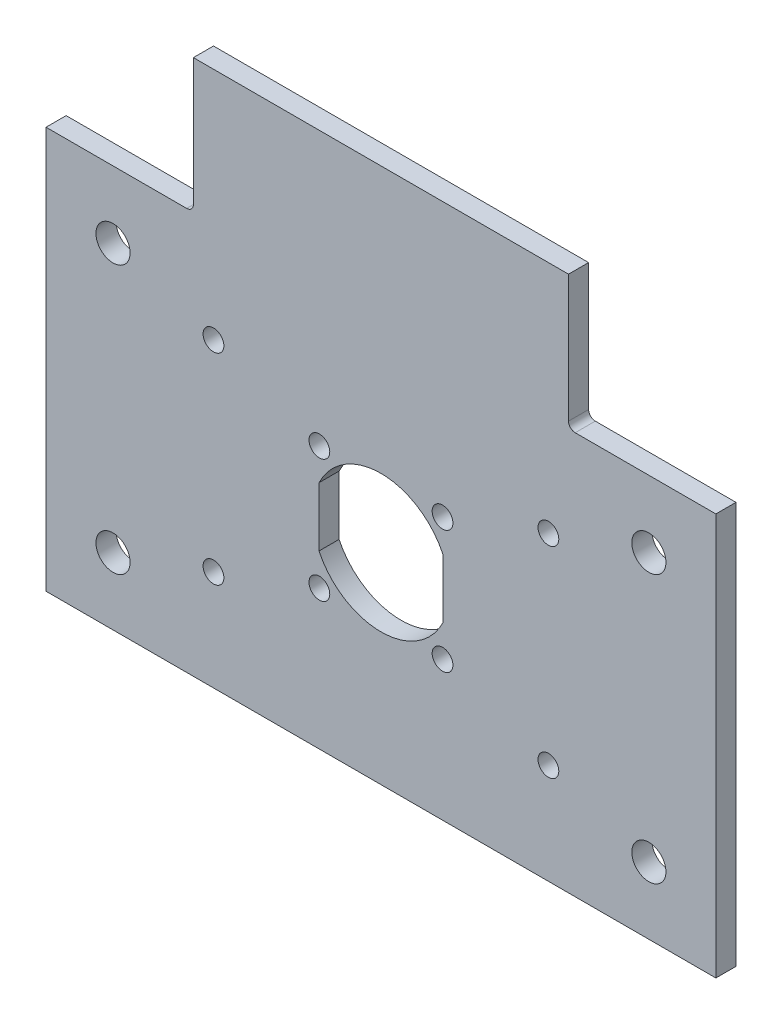
ISO-10303-21;
HEADER;
FILE_DESCRIPTION(('STEP AP214'),'2;1');
FILE_NAME('part.step','',(''),(''),'','','');
FILE_SCHEMA(('AUTOMOTIVE_DESIGN { 1 0 10303 214 1 1 1 1 }'));
ENDSEC;
DATA;
#1=APPLICATION_CONTEXT('core data for automotive mechanical design processes');
#2=APPLICATION_PROTOCOL_DEFINITION('international standard','automotive_design',2000,#1);
#3=PRODUCT_CONTEXT('',#1,'mechanical');
#4=PRODUCT('Part','Part','',(#3));
#5=PRODUCT_RELATED_PRODUCT_CATEGORY('part','',(#4));
#6=PRODUCT_DEFINITION_FORMATION('','',#4);
#7=PRODUCT_DEFINITION_CONTEXT('part definition',#1,'design');
#8=PRODUCT_DEFINITION('design','',#6,#7);
#9=PRODUCT_DEFINITION_SHAPE('','',#8);
#10=(LENGTH_UNIT() NAMED_UNIT(*) SI_UNIT(.MILLI.,.METRE.));
#11=(NAMED_UNIT(*) PLANE_ANGLE_UNIT() SI_UNIT($,.RADIAN.));
#12=(NAMED_UNIT(*) SI_UNIT($,.STERADIAN.) SOLID_ANGLE_UNIT());
#13=UNCERTAINTY_MEASURE_WITH_UNIT(LENGTH_MEASURE(1.E-05),#10,'distance_accuracy_value','');
#14=(GEOMETRIC_REPRESENTATION_CONTEXT(3) GLOBAL_UNCERTAINTY_ASSIGNED_CONTEXT((#13)) GLOBAL_UNIT_ASSIGNED_CONTEXT((#10,
#11,#12)) REPRESENTATION_CONTEXT('',''));
#15=CARTESIAN_POINT('',(0.,0.,0.));
#16=DIRECTION('',(0.,0.,1.));
#17=DIRECTION('',(1.,0.,0.));
#18=AXIS2_PLACEMENT_3D('',#15,#16,#17);
#19=CARTESIAN_POINT('',(0.,0.,3.));
#20=DIRECTION('',(0.,0.,1.));
#21=DIRECTION('',(1.,0.,0.));
#22=AXIS2_PLACEMENT_3D('',#19,#20,#21);
#23=PLANE('',#22);
#24=CARTESIAN_POINT('',(-25.,45.,3.));
#25=DIRECTION('',(0.,0.,1.));
#26=DIRECTION('',(1.,0.,0.));
#27=AXIS2_PLACEMENT_3D('',#24,#25,#26);
#28=CIRCLE('',#27,1.55);
#29=CARTESIAN_POINT('',(-23.45,45.,3.));
#30=VERTEX_POINT('',#29);
#31=EDGE_CURVE('E592',#30,#30,#28,.T.);
#32=ORIENTED_EDGE('',*,*,#31,.F.);
#33=EDGE_LOOP('',(#32));
#34=FACE_BOUND('',#33,.T.);
#35=CARTESIAN_POINT('',(-25.,15.,3.));
#36=DIRECTION('',(0.,0.,1.));
#37=DIRECTION('',(1.,0.,0.));
#38=AXIS2_PLACEMENT_3D('',#35,#36,#37);
#39=CIRCLE('',#38,1.55);
#40=CARTESIAN_POINT('',(-23.45,15.,3.));
#41=VERTEX_POINT('',#40);
#42=EDGE_CURVE('E596',#41,#41,#39,.T.);
#43=ORIENTED_EDGE('',*,*,#42,.F.);
#44=EDGE_LOOP('',(#43));
#45=FACE_BOUND('',#44,.T.);
#46=CARTESIAN_POINT('',(25.,15.,3.));
#47=DIRECTION('',(0.,0.,1.));
#48=DIRECTION('',(1.,0.,0.));
#49=AXIS2_PLACEMENT_3D('',#46,#47,#48);
#50=CIRCLE('',#49,1.55);
#51=CARTESIAN_POINT('',(26.55,15.,3.));
#52=VERTEX_POINT('',#51);
#53=EDGE_CURVE('E676',#52,#52,#50,.T.);
#54=ORIENTED_EDGE('',*,*,#53,.F.);
#55=EDGE_LOOP('',(#54));
#56=FACE_BOUND('',#55,.T.);
#57=CARTESIAN_POINT('',(25.,45.,3.));
#58=DIRECTION('',(0.,0.,1.));
#59=DIRECTION('',(1.,0.,0.));
#60=AXIS2_PLACEMENT_3D('',#57,#58,#59);
#61=CIRCLE('',#60,1.55);
#62=CARTESIAN_POINT('',(26.55,45.,3.));
#63=VERTEX_POINT('',#62);
#64=EDGE_CURVE('E605',#63,#63,#61,.T.);
#65=ORIENTED_EDGE('',*,*,#64,.F.);
#66=EDGE_LOOP('',(#65));
#67=FACE_BOUND('',#66,.T.);
#68=CARTESIAN_POINT('',(40.,50.,3.));
#69=DIRECTION('',(0.,0.,1.));
#70=DIRECTION('',(-1.,0.,0.));
#71=AXIS2_PLACEMENT_3D('',#68,#69,#70);
#72=CIRCLE('',#71,2.55);
#73=CARTESIAN_POINT('',(37.45,50.,3.));
#74=VERTEX_POINT('',#73);
#75=EDGE_CURVE('E604',#74,#74,#72,.T.);
#76=ORIENTED_EDGE('',*,*,#75,.F.);
#77=EDGE_LOOP('',(#76));
#78=FACE_BOUND('',#77,.T.);
#79=CARTESIAN_POINT('',(40.,10.,3.));
#80=DIRECTION('',(0.,0.,1.));
#81=DIRECTION('',(1.,0.,0.));
#82=AXIS2_PLACEMENT_3D('',#79,#80,#81);
#83=CIRCLE('',#82,2.55);
#84=CARTESIAN_POINT('',(42.55,10.,3.));
#85=VERTEX_POINT('',#84);
#86=EDGE_CURVE('E623',#85,#85,#83,.T.);
#87=ORIENTED_EDGE('',*,*,#86,.F.);
#88=EDGE_LOOP('',(#87));
#89=FACE_BOUND('',#88,.T.);
#90=CARTESIAN_POINT('',(-40.,10.,3.));
#91=DIRECTION('',(0.,0.,1.));
#92=DIRECTION('',(-1.,0.,0.));
#93=AXIS2_PLACEMENT_3D('',#90,#91,#92);
#94=CIRCLE('',#93,2.55);
#95=CARTESIAN_POINT('',(-42.55,10.,3.));
#96=VERTEX_POINT('',#95);
#97=EDGE_CURVE('E615',#96,#96,#94,.T.);
#98=ORIENTED_EDGE('',*,*,#97,.F.);
#99=EDGE_LOOP('',(#98));
#100=FACE_BOUND('',#99,.T.);
#101=CARTESIAN_POINT('',(-40.,50.,3.));
#102=DIRECTION('',(0.,0.,1.));
#103=DIRECTION('',(1.,0.,0.));
#104=AXIS2_PLACEMENT_3D('',#101,#102,#103);
#105=CIRCLE('',#104,2.55);
#106=CARTESIAN_POINT('',(-37.45,50.,3.));
#107=VERTEX_POINT('',#106);
#108=EDGE_CURVE('E614',#107,#107,#105,.T.);
#109=ORIENTED_EDGE('',*,*,#108,.F.);
#110=EDGE_LOOP('',(#109));
#111=FACE_BOUND('',#110,.T.);
#112=CARTESIAN_POINT('',(-9.19238815542516,20.8076118445749,3.));
#113=DIRECTION('',(0.,0.,1.));
#114=DIRECTION('',(1.,0.,0.));
#115=AXIS2_PLACEMENT_3D('',#112,#113,#114);
#116=CIRCLE('',#115,1.55);
#117=CARTESIAN_POINT('',(-7.64238815542516,20.8076118445749,3.));
#118=VERTEX_POINT('',#117);
#119=EDGE_CURVE('E638',#118,#118,#116,.T.);
#120=ORIENTED_EDGE('',*,*,#119,.F.);
#121=EDGE_LOOP('',(#120));
#122=FACE_BOUND('',#121,.T.);
#123=CARTESIAN_POINT('',(9.19238815542507,20.8076118445748,3.));
#124=DIRECTION('',(0.,0.,1.));
#125=DIRECTION('',(1.,0.,0.));
#126=AXIS2_PLACEMENT_3D('',#123,#124,#125);
#127=CIRCLE('',#126,1.55);
#128=CARTESIAN_POINT('',(10.7423881554251,20.8076118445748,3.));
#129=VERTEX_POINT('',#128);
#130=EDGE_CURVE('E655',#129,#129,#127,.T.);
#131=ORIENTED_EDGE('',*,*,#130,.F.);
#132=EDGE_LOOP('',(#131));
#133=FACE_BOUND('',#132,.T.);
#134=CARTESIAN_POINT('',(9.19238815542517,39.1923881554251,3.));
#135=DIRECTION('',(0.,0.,1.));
#136=DIRECTION('',(1.,0.,0.));
#137=AXIS2_PLACEMENT_3D('',#134,#135,#136);
#138=CIRCLE('',#137,1.55);
#139=CARTESIAN_POINT('',(10.7423881554252,39.1923881554251,3.));
#140=VERTEX_POINT('',#139);
#141=EDGE_CURVE('E647',#140,#140,#138,.T.);
#142=ORIENTED_EDGE('',*,*,#141,.F.);
#143=EDGE_LOOP('',(#142));
#144=FACE_BOUND('',#143,.T.);
#145=CARTESIAN_POINT('',(-9.19238815542507,39.1923881554252,3.));
#146=DIRECTION('',(0.,0.,1.));
#147=DIRECTION('',(1.,0.,0.));
#148=AXIS2_PLACEMENT_3D('',#145,#146,#147);
#149=CIRCLE('',#148,1.55);
#150=CARTESIAN_POINT('',(-7.64238815542507,39.1923881554252,3.));
#151=VERTEX_POINT('',#150);
#152=EDGE_CURVE('E646',#151,#151,#149,.T.);
#153=ORIENTED_EDGE('',*,*,#152,.F.);
#154=EDGE_LOOP('',(#153));
#155=FACE_BOUND('',#154,.T.);
#156=DIRECTION('',(-1.,0.,0.));
#157=VECTOR('',#156,1.);
#158=CARTESIAN_POINT('',(28.,80.,3.));
#159=LINE('',#158,#157);
#160=CARTESIAN_POINT('',(28.,80.,3.));
#161=VERTEX_POINT('',#160);
#162=CARTESIAN_POINT('',(-28.,80.,3.));
#163=VERTEX_POINT('',#162);
#164=EDGE_CURVE('E194',#161,#163,#159,.T.);
#165=ORIENTED_EDGE('',*,*,#164,.T.);
#166=DIRECTION('',(0.,-1.,0.));
#167=VECTOR('',#166,1.);
#168=CARTESIAN_POINT('',(-28.,80.,3.));
#169=LINE('',#168,#167);
#170=CARTESIAN_POINT('',(-28.,61.,3.));
#171=VERTEX_POINT('',#170);
#172=EDGE_CURVE('E198',#163,#171,#169,.T.);
#173=ORIENTED_EDGE('',*,*,#172,.T.);
#174=CARTESIAN_POINT('',(-29.,61.,3.));
#175=DIRECTION('',(0.,0.,1.));
#176=DIRECTION('',(1.,0.,0.));
#177=AXIS2_PLACEMENT_3D('',#174,#175,#176);
#178=CIRCLE('',#177,1.);
#179=CARTESIAN_POINT('',(-29.,60.,3.));
#180=VERTEX_POINT('',#179);
#181=EDGE_CURVE('E11',#171,#180,#178,.F.);
#182=ORIENTED_EDGE('',*,*,#181,.T.);
#183=DIRECTION('',(-1.,0.,0.));
#184=VECTOR('',#183,1.);
#185=CARTESIAN_POINT('',(-28.,60.,3.));
#186=LINE('',#185,#184);
#187=CARTESIAN_POINT('',(-50.,60.,3.));
#188=VERTEX_POINT('',#187);
#189=EDGE_CURVE('E202',#180,#188,#186,.T.);
#190=ORIENTED_EDGE('',*,*,#189,.T.);
#191=DIRECTION('',(0.,-1.,0.));
#192=VECTOR('',#191,1.);
#193=CARTESIAN_POINT('',(-50.,60.,3.));
#194=LINE('',#193,#192);
#195=CARTESIAN_POINT('',(-50.,0.,3.));
#196=VERTEX_POINT('',#195);
#197=EDGE_CURVE('E205',#188,#196,#194,.T.);
#198=ORIENTED_EDGE('',*,*,#197,.T.);
#199=DIRECTION('',(1.,0.,0.));
#200=VECTOR('',#199,1.);
#201=CARTESIAN_POINT('',(-50.,0.,3.));
#202=LINE('',#201,#200);
#203=CARTESIAN_POINT('',(50.,0.,3.));
#204=VERTEX_POINT('',#203);
#205=EDGE_CURVE('E208',#196,#204,#202,.T.);
#206=ORIENTED_EDGE('',*,*,#205,.T.);
#207=DIRECTION('',(0.,1.,0.));
#208=VECTOR('',#207,1.);
#209=CARTESIAN_POINT('',(50.,60.,3.));
#210=LINE('',#209,#208);
#211=CARTESIAN_POINT('',(50.,60.,3.));
#212=VERTEX_POINT('',#211);
#213=EDGE_CURVE('E211',#204,#212,#210,.T.);
#214=ORIENTED_EDGE('',*,*,#213,.T.);
#215=DIRECTION('',(-1.,0.,0.));
#216=VECTOR('',#215,1.);
#217=CARTESIAN_POINT('',(28.,60.,3.));
#218=LINE('',#217,#216);
#219=CARTESIAN_POINT('',(29.,60.,3.));
#220=VERTEX_POINT('',#219);
#221=EDGE_CURVE('E214',#212,#220,#218,.T.);
#222=ORIENTED_EDGE('',*,*,#221,.T.);
#223=CARTESIAN_POINT('',(29.,61.,3.));
#224=DIRECTION('',(0.,0.,1.));
#225=DIRECTION('',(1.,0.,0.));
#226=AXIS2_PLACEMENT_3D('',#223,#224,#225);
#227=CIRCLE('',#226,1.);
#228=CARTESIAN_POINT('',(28.,61.,3.));
#229=VERTEX_POINT('',#228);
#230=EDGE_CURVE('E285',#220,#229,#227,.F.);
#231=ORIENTED_EDGE('',*,*,#230,.T.);
#232=DIRECTION('',(0.,1.,0.));
#233=VECTOR('',#232,1.);
#234=CARTESIAN_POINT('',(28.,80.,3.));
#235=LINE('',#234,#233);
#236=EDGE_CURVE('E218',#229,#161,#235,.T.);
#237=ORIENTED_EDGE('',*,*,#236,.T.);
#238=EDGE_LOOP('',(#165,#173,#182,#190,#198,#206,#214,#222,#231,#237));
#239=FACE_BOUND('',#238,.T.);
#240=DIRECTION('',(0.,-1.,0.));
#241=VECTOR('',#240,1.);
#242=CARTESIAN_POINT('',(-9.25,34.4158804331639,3.));
#243=LINE('',#242,#241);
#244=CARTESIAN_POINT('',(-9.25,34.4158804331639,3.));
#245=VERTEX_POINT('',#244);
#246=CARTESIAN_POINT('',(-9.25,25.5841195668361,3.));
#247=VERTEX_POINT('',#246);
#248=EDGE_CURVE('E150',#245,#247,#243,.T.);
#249=ORIENTED_EDGE('',*,*,#248,.F.);
#250=CARTESIAN_POINT('',(0.,30.,3.));
#251=DIRECTION('',(0.,0.,1.));
#252=DIRECTION('',(1.,0.,0.));
#253=AXIS2_PLACEMENT_3D('',#250,#251,#252);
#254=CIRCLE('',#253,10.25);
#255=CARTESIAN_POINT('',(9.25,34.4158804331639,3.));
#256=VERTEX_POINT('',#255);
#257=EDGE_CURVE('E139',#256,#245,#254,.T.);
#258=ORIENTED_EDGE('',*,*,#257,.F.);
#259=DIRECTION('',(0.,1.,0.));
#260=VECTOR('',#259,1.);
#261=CARTESIAN_POINT('',(9.25,34.4158804331639,3.));
#262=LINE('',#261,#260);
#263=CARTESIAN_POINT('',(9.25,25.5841195668361,3.));
#264=VERTEX_POINT('',#263);
#265=EDGE_CURVE('E168',#264,#256,#262,.T.);
#266=ORIENTED_EDGE('',*,*,#265,.F.);
#267=CARTESIAN_POINT('',(0.,30.,3.));
#268=DIRECTION('',(0.,0.,1.));
#269=DIRECTION('',(1.,0.,0.));
#270=AXIS2_PLACEMENT_3D('',#267,#268,#269);
#271=CIRCLE('',#270,10.25);
#272=EDGE_CURVE('E164',#247,#264,#271,.T.);
#273=ORIENTED_EDGE('',*,*,#272,.F.);
#274=EDGE_LOOP('',(#249,#258,#266,#273));
#275=FACE_BOUND('',#274,.T.);
#276=ADVANCED_FACE('F38',(#34,#45,#56,#67,#78,#89,#100,#111,#122,#133,#144,#155,#239,#275),#23,.T.);
#277=CARTESIAN_POINT('',(0.,0.,0.));
#278=DIRECTION('',(0.,0.,1.));
#279=DIRECTION('',(1.,0.,0.));
#280=AXIS2_PLACEMENT_3D('',#277,#278,#279);
#281=PLANE('',#280);
#282=CARTESIAN_POINT('',(-25.,45.,0.));
#283=DIRECTION('',(0.,0.,1.));
#284=DIRECTION('',(1.,0.,0.));
#285=AXIS2_PLACEMENT_3D('',#282,#283,#284);
#286=CIRCLE('',#285,1.55);
#287=CARTESIAN_POINT('',(-23.45,45.,0.));
#288=VERTEX_POINT('',#287);
#289=EDGE_CURVE('E590',#288,#288,#286,.T.);
#290=ORIENTED_EDGE('',*,*,#289,.T.);
#291=EDGE_LOOP('',(#290));
#292=FACE_BOUND('',#291,.T.);
#293=CARTESIAN_POINT('',(-25.,15.,0.));
#294=DIRECTION('',(0.,0.,1.));
#295=DIRECTION('',(1.,0.,0.));
#296=AXIS2_PLACEMENT_3D('',#293,#294,#295);
#297=CIRCLE('',#296,1.55);
#298=CARTESIAN_POINT('',(-23.45,15.,0.));
#299=VERTEX_POINT('',#298);
#300=EDGE_CURVE('E680',#299,#299,#297,.T.);
#301=ORIENTED_EDGE('',*,*,#300,.T.);
#302=EDGE_LOOP('',(#301));
#303=FACE_BOUND('',#302,.T.);
#304=CARTESIAN_POINT('',(25.,15.,0.));
#305=DIRECTION('',(0.,0.,1.));
#306=DIRECTION('',(1.,0.,0.));
#307=AXIS2_PLACEMENT_3D('',#304,#305,#306);
#308=CIRCLE('',#307,1.55);
#309=CARTESIAN_POINT('',(26.55,15.,0.));
#310=VERTEX_POINT('',#309);
#311=EDGE_CURVE('E609',#310,#310,#308,.T.);
#312=ORIENTED_EDGE('',*,*,#311,.T.);
#313=EDGE_LOOP('',(#312));
#314=FACE_BOUND('',#313,.T.);
#315=CARTESIAN_POINT('',(25.,45.,0.));
#316=DIRECTION('',(0.,0.,1.));
#317=DIRECTION('',(1.,0.,0.));
#318=AXIS2_PLACEMENT_3D('',#315,#316,#317);
#319=CIRCLE('',#318,1.55);
#320=CARTESIAN_POINT('',(26.55,45.,0.));
#321=VERTEX_POINT('',#320);
#322=EDGE_CURVE('E600',#321,#321,#319,.T.);
#323=ORIENTED_EDGE('',*,*,#322,.T.);
#324=EDGE_LOOP('',(#323));
#325=FACE_BOUND('',#324,.T.);
#326=CARTESIAN_POINT('',(40.,50.,0.));
#327=DIRECTION('',(0.,0.,1.));
#328=DIRECTION('',(-1.,0.,0.));
#329=AXIS2_PLACEMENT_3D('',#326,#327,#328);
#330=CIRCLE('',#329,2.55);
#331=CARTESIAN_POINT('',(37.45,50.,0.));
#332=VERTEX_POINT('',#331);
#333=EDGE_CURVE('E627',#332,#332,#330,.T.);
#334=ORIENTED_EDGE('',*,*,#333,.T.);
#335=EDGE_LOOP('',(#334));
#336=FACE_BOUND('',#335,.T.);
#337=CARTESIAN_POINT('',(40.,10.,0.));
#338=DIRECTION('',(0.,0.,1.));
#339=DIRECTION('',(1.,0.,0.));
#340=AXIS2_PLACEMENT_3D('',#337,#338,#339);
#341=CIRCLE('',#340,2.55);
#342=CARTESIAN_POINT('',(42.55,10.,0.));
#343=VERTEX_POINT('',#342);
#344=EDGE_CURVE('E619',#343,#343,#341,.T.);
#345=ORIENTED_EDGE('',*,*,#344,.T.);
#346=EDGE_LOOP('',(#345));
#347=FACE_BOUND('',#346,.T.);
#348=CARTESIAN_POINT('',(-40.,10.,0.));
#349=DIRECTION('',(0.,0.,1.));
#350=DIRECTION('',(-1.,0.,0.));
#351=AXIS2_PLACEMENT_3D('',#348,#349,#350);
#352=CIRCLE('',#351,2.55);
#353=CARTESIAN_POINT('',(-42.55,10.,0.));
#354=VERTEX_POINT('',#353);
#355=EDGE_CURVE('E610',#354,#354,#352,.T.);
#356=ORIENTED_EDGE('',*,*,#355,.T.);
#357=EDGE_LOOP('',(#356));
#358=FACE_BOUND('',#357,.T.);
#359=CARTESIAN_POINT('',(-40.,50.,0.));
#360=DIRECTION('',(0.,0.,1.));
#361=DIRECTION('',(1.,0.,0.));
#362=AXIS2_PLACEMENT_3D('',#359,#360,#361);
#363=CIRCLE('',#362,2.55);
#364=CARTESIAN_POINT('',(-37.45,50.,0.));
#365=VERTEX_POINT('',#364);
#366=EDGE_CURVE('E634',#365,#365,#363,.T.);
#367=ORIENTED_EDGE('',*,*,#366,.T.);
#368=EDGE_LOOP('',(#367));
#369=FACE_BOUND('',#368,.T.);
#370=CARTESIAN_POINT('',(-9.19238815542516,20.8076118445749,0.));
#371=DIRECTION('',(0.,0.,1.));
#372=DIRECTION('',(1.,0.,0.));
#373=AXIS2_PLACEMENT_3D('',#370,#371,#372);
#374=CIRCLE('',#373,1.55);
#375=CARTESIAN_POINT('',(-7.64238815542516,20.8076118445749,0.));
#376=VERTEX_POINT('',#375);
#377=EDGE_CURVE('E659',#376,#376,#374,.T.);
#378=ORIENTED_EDGE('',*,*,#377,.T.);
#379=EDGE_LOOP('',(#378));
#380=FACE_BOUND('',#379,.T.);
#381=CARTESIAN_POINT('',(9.19238815542507,20.8076118445748,0.));
#382=DIRECTION('',(0.,0.,1.));
#383=DIRECTION('',(1.,0.,0.));
#384=AXIS2_PLACEMENT_3D('',#381,#382,#383);
#385=CIRCLE('',#384,1.55);
#386=CARTESIAN_POINT('',(10.7423881554251,20.8076118445748,0.));
#387=VERTEX_POINT('',#386);
#388=EDGE_CURVE('E651',#387,#387,#385,.T.);
#389=ORIENTED_EDGE('',*,*,#388,.T.);
#390=EDGE_LOOP('',(#389));
#391=FACE_BOUND('',#390,.T.);
#392=CARTESIAN_POINT('',(9.19238815542517,39.1923881554251,0.));
#393=DIRECTION('',(0.,0.,1.));
#394=DIRECTION('',(1.,0.,0.));
#395=AXIS2_PLACEMENT_3D('',#392,#393,#394);
#396=CIRCLE('',#395,1.55);
#397=CARTESIAN_POINT('',(10.7423881554252,39.1923881554251,0.));
#398=VERTEX_POINT('',#397);
#399=EDGE_CURVE('E642',#398,#398,#396,.T.);
#400=ORIENTED_EDGE('',*,*,#399,.T.);
#401=EDGE_LOOP('',(#400));
#402=FACE_BOUND('',#401,.T.);
#403=CARTESIAN_POINT('',(-9.19238815542507,39.1923881554252,0.));
#404=DIRECTION('',(0.,0.,1.));
#405=DIRECTION('',(1.,0.,0.));
#406=AXIS2_PLACEMENT_3D('',#403,#404,#405);
#407=CIRCLE('',#406,1.55);
#408=CARTESIAN_POINT('',(-7.64238815542507,39.1923881554252,0.));
#409=VERTEX_POINT('',#408);
#410=EDGE_CURVE('E177',#409,#409,#407,.T.);
#411=ORIENTED_EDGE('',*,*,#410,.T.);
#412=EDGE_LOOP('',(#411));
#413=FACE_BOUND('',#412,.T.);
#414=DIRECTION('',(-1.,0.,0.));
#415=VECTOR('',#414,1.);
#416=CARTESIAN_POINT('',(28.,80.,0.));
#417=LINE('',#416,#415);
#418=CARTESIAN_POINT('',(28.,80.,0.));
#419=VERTEX_POINT('',#418);
#420=CARTESIAN_POINT('',(-28.,80.,0.));
#421=VERTEX_POINT('',#420);
#422=EDGE_CURVE('E159',#419,#421,#417,.T.);
#423=ORIENTED_EDGE('',*,*,#422,.F.);
#424=DIRECTION('',(0.,1.,0.));
#425=VECTOR('',#424,1.);
#426=CARTESIAN_POINT('',(28.,80.,0.));
#427=LINE('',#426,#425);
#428=CARTESIAN_POINT('',(28.,61.,0.));
#429=VERTEX_POINT('',#428);
#430=EDGE_CURVE('E199',#429,#419,#427,.T.);
#431=ORIENTED_EDGE('',*,*,#430,.F.);
#432=CARTESIAN_POINT('',(29.,61.,0.));
#433=DIRECTION('',(0.,0.,1.));
#434=DIRECTION('',(1.,0.,0.));
#435=AXIS2_PLACEMENT_3D('',#432,#433,#434);
#436=CIRCLE('',#435,1.);
#437=CARTESIAN_POINT('',(29.,60.,0.));
#438=VERTEX_POINT('',#437);
#439=EDGE_CURVE('E282',#429,#438,#436,.T.);
#440=ORIENTED_EDGE('',*,*,#439,.T.);
#441=DIRECTION('',(-1.,0.,0.));
#442=VECTOR('',#441,1.);
#443=CARTESIAN_POINT('',(28.,60.,0.));
#444=LINE('',#443,#442);
#445=CARTESIAN_POINT('',(50.,60.,0.));
#446=VERTEX_POINT('',#445);
#447=EDGE_CURVE('E240',#446,#438,#444,.T.);
#448=ORIENTED_EDGE('',*,*,#447,.F.);
#449=DIRECTION('',(0.,1.,0.));
#450=VECTOR('',#449,1.);
#451=CARTESIAN_POINT('',(50.,60.,0.));
#452=LINE('',#451,#450);
#453=CARTESIAN_POINT('',(50.,0.,0.));
#454=VERTEX_POINT('',#453);
#455=EDGE_CURVE('E237',#454,#446,#452,.T.);
#456=ORIENTED_EDGE('',*,*,#455,.F.);
#457=DIRECTION('',(1.,0.,0.));
#458=VECTOR('',#457,1.);
#459=CARTESIAN_POINT('',(-50.,0.,0.));
#460=LINE('',#459,#458);
#461=CARTESIAN_POINT('',(-50.,0.,0.));
#462=VERTEX_POINT('',#461);
#463=EDGE_CURVE('E234',#462,#454,#460,.T.);
#464=ORIENTED_EDGE('',*,*,#463,.F.);
#465=DIRECTION('',(0.,-1.,0.));
#466=VECTOR('',#465,1.);
#467=CARTESIAN_POINT('',(-50.,60.,0.));
#468=LINE('',#467,#466);
#469=CARTESIAN_POINT('',(-50.,60.,0.));
#470=VERTEX_POINT('',#469);
#471=EDGE_CURVE('E231',#470,#462,#468,.T.);
#472=ORIENTED_EDGE('',*,*,#471,.F.);
#473=DIRECTION('',(-1.,0.,0.));
#474=VECTOR('',#473,1.);
#475=CARTESIAN_POINT('',(-28.,60.,0.));
#476=LINE('',#475,#474);
#477=CARTESIAN_POINT('',(-29.,60.,0.));
#478=VERTEX_POINT('',#477);
#479=EDGE_CURVE('E228',#478,#470,#476,.T.);
#480=ORIENTED_EDGE('',*,*,#479,.F.);
#481=CARTESIAN_POINT('',(-29.,61.,0.));
#482=DIRECTION('',(0.,0.,1.));
#483=DIRECTION('',(1.,0.,0.));
#484=AXIS2_PLACEMENT_3D('',#481,#482,#483);
#485=CIRCLE('',#484,1.);
#486=CARTESIAN_POINT('',(-28.,61.,0.));
#487=VERTEX_POINT('',#486);
#488=EDGE_CURVE('E47',#478,#487,#485,.T.);
#489=ORIENTED_EDGE('',*,*,#488,.T.);
#490=DIRECTION('',(0.,-1.,0.));
#491=VECTOR('',#490,1.);
#492=CARTESIAN_POINT('',(-28.,80.,0.));
#493=LINE('',#492,#491);
#494=EDGE_CURVE('E225',#421,#487,#493,.T.);
#495=ORIENTED_EDGE('',*,*,#494,.F.);
#496=EDGE_LOOP('',(#423,#431,#440,#448,#456,#464,#472,#480,#489,#495));
#497=FACE_BOUND('',#496,.T.);
#498=CARTESIAN_POINT('',(0.,30.,0.));
#499=DIRECTION('',(0.,0.,1.));
#500=DIRECTION('',(1.,0.,0.));
#501=AXIS2_PLACEMENT_3D('',#498,#499,#500);
#502=CIRCLE('',#501,10.25);
#503=CARTESIAN_POINT('',(9.25,34.4158804331639,0.));
#504=VERTEX_POINT('',#503);
#505=CARTESIAN_POINT('',(-9.25,34.4158804331639,0.));
#506=VERTEX_POINT('',#505);
#507=EDGE_CURVE('E174',#504,#506,#502,.T.);
#508=ORIENTED_EDGE('',*,*,#507,.T.);
#509=DIRECTION('',(0.,-1.,0.));
#510=VECTOR('',#509,1.);
#511=CARTESIAN_POINT('',(-9.25,34.4158804331639,0.));
#512=LINE('',#511,#510);
#513=CARTESIAN_POINT('',(-9.25,25.5841195668361,0.));
#514=VERTEX_POINT('',#513);
#515=EDGE_CURVE('E157',#506,#514,#512,.T.);
#516=ORIENTED_EDGE('',*,*,#515,.T.);
#517=CARTESIAN_POINT('',(0.,30.,0.));
#518=DIRECTION('',(0.,0.,1.));
#519=DIRECTION('',(1.,0.,0.));
#520=AXIS2_PLACEMENT_3D('',#517,#518,#519);
#521=CIRCLE('',#520,10.25);
#522=CARTESIAN_POINT('',(9.25,25.5841195668361,0.));
#523=VERTEX_POINT('',#522);
#524=EDGE_CURVE('E180',#514,#523,#521,.T.);
#525=ORIENTED_EDGE('',*,*,#524,.T.);
#526=DIRECTION('',(0.,1.,0.));
#527=VECTOR('',#526,1.);
#528=CARTESIAN_POINT('',(9.25,34.4158804331639,0.));
#529=LINE('',#528,#527);
#530=EDGE_CURVE('E151',#523,#504,#529,.T.);
#531=ORIENTED_EDGE('',*,*,#530,.T.);
#532=EDGE_LOOP('',(#508,#516,#525,#531));
#533=FACE_BOUND('',#532,.T.);
#534=ADVANCED_FACE('F303',(#292,#303,#314,#325,#336,#347,#358,#369,#380,#391,#402,#413,#497,
#533),#281,.F.);
#535=CARTESIAN_POINT('',(28.,80.,3.));
#536=DIRECTION('',(0.,-1.,0.));
#537=DIRECTION('',(0.,0.,-1.));
#538=AXIS2_PLACEMENT_3D('',#535,#536,#537);
#539=PLANE('',#538);
#540=ORIENTED_EDGE('',*,*,#422,.T.);
#541=DIRECTION('',(0.,0.,-1.));
#542=VECTOR('',#541,1.);
#543=CARTESIAN_POINT('',(-28.,80.,3.));
#544=LINE('',#543,#542);
#545=EDGE_CURVE('E265',#163,#421,#544,.T.);
#546=ORIENTED_EDGE('',*,*,#545,.F.);
#547=ORIENTED_EDGE('',*,*,#164,.F.);
#548=DIRECTION('',(0.,0.,-1.));
#549=VECTOR('',#548,1.);
#550=CARTESIAN_POINT('',(28.,80.,3.));
#551=LINE('',#550,#549);
#552=EDGE_CURVE('E221',#161,#419,#551,.T.);
#553=ORIENTED_EDGE('',*,*,#552,.T.);
#554=EDGE_LOOP('',(#540,#546,#547,#553));
#555=FACE_BOUND('',#554,.T.);
#556=ADVANCED_FACE('F332',(#555),#539,.F.);
#557=CARTESIAN_POINT('',(-28.,80.,3.));
#558=DIRECTION('',(1.,0.,0.));
#559=DIRECTION('',(0.,0.,-1.));
#560=AXIS2_PLACEMENT_3D('',#557,#558,#559);
#561=PLANE('',#560);
#562=ORIENTED_EDGE('',*,*,#494,.T.);
#563=DIRECTION('',(0.,0.,-1.));
#564=VECTOR('',#563,1.);
#565=CARTESIAN_POINT('',(-28.,61.,3.));
#566=LINE('',#565,#564);
#567=EDGE_CURVE('E54',#487,#171,#566,.F.);
#568=ORIENTED_EDGE('',*,*,#567,.T.);
#569=ORIENTED_EDGE('',*,*,#172,.F.);
#570=ORIENTED_EDGE('',*,*,#545,.T.);
#571=EDGE_LOOP('',(#562,#568,#569,#570));
#572=FACE_BOUND('',#571,.T.);
#573=ADVANCED_FACE('F330',(#572),#561,.F.);
#574=CARTESIAN_POINT('',(-28.,60.,3.));
#575=DIRECTION('',(0.,-1.,0.));
#576=DIRECTION('',(0.,0.,-1.));
#577=AXIS2_PLACEMENT_3D('',#574,#575,#576);
#578=PLANE('',#577);
#579=ORIENTED_EDGE('',*,*,#189,.F.);
#580=DIRECTION('',(0.,0.,-1.));
#581=VECTOR('',#580,1.);
#582=CARTESIAN_POINT('',(-29.,60.,0.));
#583=LINE('',#582,#581);
#584=EDGE_CURVE('E276',#180,#478,#583,.T.);
#585=ORIENTED_EDGE('',*,*,#584,.T.);
#586=ORIENTED_EDGE('',*,*,#479,.T.);
#587=DIRECTION('',(0.,0.,-1.));
#588=VECTOR('',#587,1.);
#589=CARTESIAN_POINT('',(-50.,60.,3.));
#590=LINE('',#589,#588);
#591=EDGE_CURVE('E261',#188,#470,#590,.T.);
#592=ORIENTED_EDGE('',*,*,#591,.F.);
#593=EDGE_LOOP('',(#579,#585,#586,#592));
#594=FACE_BOUND('',#593,.T.);
#595=ADVANCED_FACE('F325',(#594),#578,.F.);
#596=CARTESIAN_POINT('',(-50.,60.,3.));
#597=DIRECTION('',(1.,0.,0.));
#598=DIRECTION('',(0.,1.,0.));
#599=AXIS2_PLACEMENT_3D('',#596,#597,#598);
#600=PLANE('',#599);
#601=ORIENTED_EDGE('',*,*,#471,.T.);
#602=DIRECTION('',(0.,0.,-1.));
#603=VECTOR('',#602,1.);
#604=CARTESIAN_POINT('',(-50.,0.,3.));
#605=LINE('',#604,#603);
#606=EDGE_CURVE('E257',#196,#462,#605,.T.);
#607=ORIENTED_EDGE('',*,*,#606,.F.);
#608=ORIENTED_EDGE('',*,*,#197,.F.);
#609=ORIENTED_EDGE('',*,*,#591,.T.);
#610=EDGE_LOOP('',(#601,#607,#608,#609));
#611=FACE_BOUND('',#610,.T.);
#612=ADVANCED_FACE('F321',(#611),#600,.F.);
#613=CARTESIAN_POINT('',(-50.,0.,3.));
#614=DIRECTION('',(0.,1.,0.));
#615=DIRECTION('',(0.,0.,1.));
#616=AXIS2_PLACEMENT_3D('',#613,#614,#615);
#617=PLANE('',#616);
#618=ORIENTED_EDGE('',*,*,#463,.T.);
#619=DIRECTION('',(0.,0.,-1.));
#620=VECTOR('',#619,1.);
#621=CARTESIAN_POINT('',(50.,0.,3.));
#622=LINE('',#621,#620);
#623=EDGE_CURVE('E253',#204,#454,#622,.T.);
#624=ORIENTED_EDGE('',*,*,#623,.F.);
#625=ORIENTED_EDGE('',*,*,#205,.F.);
#626=ORIENTED_EDGE('',*,*,#606,.T.);
#627=EDGE_LOOP('',(#618,#624,#625,#626));
#628=FACE_BOUND('',#627,.T.);
#629=ADVANCED_FACE('F316',(#628),#617,.F.);
#630=CARTESIAN_POINT('',(50.,60.,3.));
#631=DIRECTION('',(-1.,0.,0.));
#632=DIRECTION('',(0.,-1.,0.));
#633=AXIS2_PLACEMENT_3D('',#630,#631,#632);
#634=PLANE('',#633);
#635=ORIENTED_EDGE('',*,*,#455,.T.);
#636=DIRECTION('',(0.,0.,-1.));
#637=VECTOR('',#636,1.);
#638=CARTESIAN_POINT('',(50.,60.,3.));
#639=LINE('',#638,#637);
#640=EDGE_CURVE('E249',#212,#446,#639,.T.);
#641=ORIENTED_EDGE('',*,*,#640,.F.);
#642=ORIENTED_EDGE('',*,*,#213,.F.);
#643=ORIENTED_EDGE('',*,*,#623,.T.);
#644=EDGE_LOOP('',(#635,#641,#642,#643));
#645=FACE_BOUND('',#644,.T.);
#646=ADVANCED_FACE('F311',(#645),#634,.F.);
#647=CARTESIAN_POINT('',(28.,60.,3.));
#648=DIRECTION('',(0.,-1.,0.));
#649=DIRECTION('',(0.,0.,-1.));
#650=AXIS2_PLACEMENT_3D('',#647,#648,#649);
#651=PLANE('',#650);
#652=ORIENTED_EDGE('',*,*,#447,.T.);
#653=DIRECTION('',(0.,0.,-1.));
#654=VECTOR('',#653,1.);
#655=CARTESIAN_POINT('',(29.,60.,3.));
#656=LINE('',#655,#654);
#657=EDGE_CURVE('E273',#438,#220,#656,.F.);
#658=ORIENTED_EDGE('',*,*,#657,.T.);
#659=ORIENTED_EDGE('',*,*,#221,.F.);
#660=ORIENTED_EDGE('',*,*,#640,.T.);
#661=EDGE_LOOP('',(#652,#658,#659,#660));
#662=FACE_BOUND('',#661,.T.);
#663=ADVANCED_FACE('F307',(#662),#651,.F.);
#664=CARTESIAN_POINT('',(28.,80.,3.));
#665=DIRECTION('',(-1.,0.,0.));
#666=DIRECTION('',(0.,0.,1.));
#667=AXIS2_PLACEMENT_3D('',#664,#665,#666);
#668=PLANE('',#667);
#669=ORIENTED_EDGE('',*,*,#236,.F.);
#670=DIRECTION('',(0.,0.,-1.));
#671=VECTOR('',#670,1.);
#672=CARTESIAN_POINT('',(28.,61.,0.));
#673=LINE('',#672,#671);
#674=EDGE_CURVE('E269',#229,#429,#673,.T.);
#675=ORIENTED_EDGE('',*,*,#674,.T.);
#676=ORIENTED_EDGE('',*,*,#430,.T.);
#677=ORIENTED_EDGE('',*,*,#552,.F.);
#678=EDGE_LOOP('',(#669,#675,#676,#677));
#679=FACE_BOUND('',#678,.T.);
#680=ADVANCED_FACE('F297',(#679),#668,.F.);
#681=CARTESIAN_POINT('',(0.,30.,3.));
#682=DIRECTION('',(0.,0.,-1.));
#683=DIRECTION('',(-1.,0.,0.));
#684=AXIS2_PLACEMENT_3D('',#681,#682,#683);
#685=CYLINDRICAL_SURFACE('',#684,10.25);
#686=ORIENTED_EDGE('',*,*,#507,.F.);
#687=DIRECTION('',(0.,0.,-1.));
#688=VECTOR('',#687,1.);
#689=CARTESIAN_POINT('',(9.25,34.4158804331639,3.));
#690=LINE('',#689,#688);
#691=EDGE_CURVE('E145',#256,#504,#690,.T.);
#692=ORIENTED_EDGE('',*,*,#691,.F.);
#693=ORIENTED_EDGE('',*,*,#257,.T.);
#694=DIRECTION('',(0.,0.,-1.));
#695=VECTOR('',#694,1.);
#696=CARTESIAN_POINT('',(-9.25,34.4158804331639,3.));
#697=LINE('',#696,#695);
#698=EDGE_CURVE('E142',#245,#506,#697,.T.);
#699=ORIENTED_EDGE('',*,*,#698,.T.);
#700=EDGE_LOOP('',(#686,#692,#693,#699));
#701=FACE_BOUND('',#700,.T.);
#702=ADVANCED_FACE('F141',(#701),#685,.F.);
#703=CARTESIAN_POINT('',(-9.25,34.4158804331639,3.));
#704=DIRECTION('',(1.,0.,0.));
#705=DIRECTION('',(0.,0.,-1.));
#706=AXIS2_PLACEMENT_3D('',#703,#704,#705);
#707=PLANE('',#706);
#708=ORIENTED_EDGE('',*,*,#515,.F.);
#709=ORIENTED_EDGE('',*,*,#698,.F.);
#710=ORIENTED_EDGE('',*,*,#248,.T.);
#711=DIRECTION('',(0.,0.,-1.));
#712=VECTOR('',#711,1.);
#713=CARTESIAN_POINT('',(-9.25,25.5841195668361,3.));
#714=LINE('',#713,#712);
#715=EDGE_CURVE('E160',#247,#514,#714,.T.);
#716=ORIENTED_EDGE('',*,*,#715,.T.);
#717=EDGE_LOOP('',(#708,#709,#710,#716));
#718=FACE_BOUND('',#717,.T.);
#719=ADVANCED_FACE('F154',(#718),#707,.T.);
#720=CARTESIAN_POINT('',(0.,30.,3.));
#721=DIRECTION('',(0.,0.,-1.));
#722=DIRECTION('',(-1.,0.,0.));
#723=AXIS2_PLACEMENT_3D('',#720,#721,#722);
#724=CYLINDRICAL_SURFACE('',#723,10.25);
#725=ORIENTED_EDGE('',*,*,#524,.F.);
#726=ORIENTED_EDGE('',*,*,#715,.F.);
#727=ORIENTED_EDGE('',*,*,#272,.T.);
#728=DIRECTION('',(0.,0.,-1.));
#729=VECTOR('',#728,1.);
#730=CARTESIAN_POINT('',(9.25,25.5841195668361,3.));
#731=LINE('',#730,#729);
#732=EDGE_CURVE('E189',#264,#523,#731,.T.);
#733=ORIENTED_EDGE('',*,*,#732,.T.);
#734=EDGE_LOOP('',(#725,#726,#727,#733));
#735=FACE_BOUND('',#734,.T.);
#736=ADVANCED_FACE('F401',(#735),#724,.F.);
#737=CARTESIAN_POINT('',(9.25,34.4158804331639,3.));
#738=DIRECTION('',(-1.,0.,0.));
#739=DIRECTION('',(0.,0.,1.));
#740=AXIS2_PLACEMENT_3D('',#737,#738,#739);
#741=PLANE('',#740);
#742=ORIENTED_EDGE('',*,*,#530,.F.);
#743=ORIENTED_EDGE('',*,*,#732,.F.);
#744=ORIENTED_EDGE('',*,*,#265,.T.);
#745=ORIENTED_EDGE('',*,*,#691,.T.);
#746=EDGE_LOOP('',(#742,#743,#744,#745));
#747=FACE_BOUND('',#746,.T.);
#748=ADVANCED_FACE('F407',(#747),#741,.T.);
#749=CARTESIAN_POINT('',(-9.19238815542507,39.1923881554252,0.));
#750=DIRECTION('',(0.,0.,1.));
#751=DIRECTION('',(1.,0.,0.));
#752=AXIS2_PLACEMENT_3D('',#749,#750,#751);
#753=CYLINDRICAL_SURFACE('',#752,1.55);
#754=ORIENTED_EDGE('',*,*,#410,.F.);
#755=EDGE_LOOP('',(#754));
#756=FACE_BOUND('',#755,.T.);
#757=ORIENTED_EDGE('',*,*,#152,.T.);
#758=EDGE_LOOP('',(#757));
#759=FACE_BOUND('',#758,.T.);
#760=ADVANCED_FACE('F415',(#756,#759),#753,.F.);
#761=CARTESIAN_POINT('',(9.19238815542517,39.1923881554251,0.));
#762=DIRECTION('',(0.,0.,1.));
#763=DIRECTION('',(1.,0.,0.));
#764=AXIS2_PLACEMENT_3D('',#761,#762,#763);
#765=CYLINDRICAL_SURFACE('',#764,1.55);
#766=ORIENTED_EDGE('',*,*,#399,.F.);
#767=EDGE_LOOP('',(#766));
#768=FACE_BOUND('',#767,.T.);
#769=ORIENTED_EDGE('',*,*,#141,.T.);
#770=EDGE_LOOP('',(#769));
#771=FACE_BOUND('',#770,.T.);
#772=ADVANCED_FACE('F423',(#768,#771),#765,.F.);
#773=CARTESIAN_POINT('',(9.19238815542507,20.8076118445748,0.));
#774=DIRECTION('',(0.,0.,1.));
#775=DIRECTION('',(1.,0.,0.));
#776=AXIS2_PLACEMENT_3D('',#773,#774,#775);
#777=CYLINDRICAL_SURFACE('',#776,1.55);
#778=ORIENTED_EDGE('',*,*,#388,.F.);
#779=EDGE_LOOP('',(#778));
#780=FACE_BOUND('',#779,.T.);
#781=ORIENTED_EDGE('',*,*,#130,.T.);
#782=EDGE_LOOP('',(#781));
#783=FACE_BOUND('',#782,.T.);
#784=ADVANCED_FACE('F431',(#780,#783),#777,.F.);
#785=CARTESIAN_POINT('',(-9.19238815542516,20.8076118445749,0.));
#786=DIRECTION('',(0.,0.,1.));
#787=DIRECTION('',(1.,0.,0.));
#788=AXIS2_PLACEMENT_3D('',#785,#786,#787);
#789=CYLINDRICAL_SURFACE('',#788,1.55);
#790=ORIENTED_EDGE('',*,*,#377,.F.);
#791=EDGE_LOOP('',(#790));
#792=FACE_BOUND('',#791,.T.);
#793=ORIENTED_EDGE('',*,*,#119,.T.);
#794=EDGE_LOOP('',(#793));
#795=FACE_BOUND('',#794,.T.);
#796=ADVANCED_FACE('F439',(#792,#795),#789,.F.);
#797=CARTESIAN_POINT('',(29.,61.,3.));
#798=DIRECTION('',(0.,0.,1.));
#799=DIRECTION('',(1.,0.,0.));
#800=AXIS2_PLACEMENT_3D('',#797,#798,#799);
#801=CYLINDRICAL_SURFACE('',#800,1.);
#802=ORIENTED_EDGE('',*,*,#230,.F.);
#803=ORIENTED_EDGE('',*,*,#657,.F.);
#804=ORIENTED_EDGE('',*,*,#439,.F.);
#805=ORIENTED_EDGE('',*,*,#674,.F.);
#806=EDGE_LOOP('',(#802,#803,#804,#805));
#807=FACE_BOUND('',#806,.T.);
#808=ADVANCED_FACE('F300',(#807),#801,.F.);
#809=CARTESIAN_POINT('',(-29.,61.,3.));
#810=DIRECTION('',(0.,0.,1.));
#811=DIRECTION('',(1.,0.,0.));
#812=AXIS2_PLACEMENT_3D('',#809,#810,#811);
#813=CYLINDRICAL_SURFACE('',#812,1.);
#814=ORIENTED_EDGE('',*,*,#181,.F.);
#815=ORIENTED_EDGE('',*,*,#567,.F.);
#816=ORIENTED_EDGE('',*,*,#488,.F.);
#817=ORIENTED_EDGE('',*,*,#584,.F.);
#818=EDGE_LOOP('',(#814,#815,#816,#817));
#819=FACE_BOUND('',#818,.T.);
#820=ADVANCED_FACE('F40',(#819),#813,.F.);
#821=CARTESIAN_POINT('',(-40.,50.,0.));
#822=DIRECTION('',(0.,0.,1.));
#823=DIRECTION('',(1.,0.,0.));
#824=AXIS2_PLACEMENT_3D('',#821,#822,#823);
#825=CYLINDRICAL_SURFACE('',#824,2.55);
#826=ORIENTED_EDGE('',*,*,#366,.F.);
#827=EDGE_LOOP('',(#826));
#828=FACE_BOUND('',#827,.T.);
#829=ORIENTED_EDGE('',*,*,#108,.T.);
#830=EDGE_LOOP('',(#829));
#831=FACE_BOUND('',#830,.T.);
#832=ADVANCED_FACE('F458',(#828,#831),#825,.F.);
#833=CARTESIAN_POINT('',(-40.,10.,0.));
#834=DIRECTION('',(0.,0.,1.));
#835=DIRECTION('',(1.,0.,0.));
#836=AXIS2_PLACEMENT_3D('',#833,#834,#835);
#837=CYLINDRICAL_SURFACE('',#836,2.55);
#838=ORIENTED_EDGE('',*,*,#355,.F.);
#839=EDGE_LOOP('',(#838));
#840=FACE_BOUND('',#839,.T.);
#841=ORIENTED_EDGE('',*,*,#97,.T.);
#842=EDGE_LOOP('',(#841));
#843=FACE_BOUND('',#842,.T.);
#844=ADVANCED_FACE('F464',(#840,#843),#837,.F.);
#845=CARTESIAN_POINT('',(40.,10.,0.));
#846=DIRECTION('',(0.,0.,1.));
#847=DIRECTION('',(1.,0.,0.));
#848=AXIS2_PLACEMENT_3D('',#845,#846,#847);
#849=CYLINDRICAL_SURFACE('',#848,2.55);
#850=ORIENTED_EDGE('',*,*,#344,.F.);
#851=EDGE_LOOP('',(#850));
#852=FACE_BOUND('',#851,.T.);
#853=ORIENTED_EDGE('',*,*,#86,.T.);
#854=EDGE_LOOP('',(#853));
#855=FACE_BOUND('',#854,.T.);
#856=ADVANCED_FACE('F472',(#852,#855),#849,.F.);
#857=CARTESIAN_POINT('',(40.,50.,0.));
#858=DIRECTION('',(0.,0.,1.));
#859=DIRECTION('',(1.,0.,0.));
#860=AXIS2_PLACEMENT_3D('',#857,#858,#859);
#861=CYLINDRICAL_SURFACE('',#860,2.55);
#862=ORIENTED_EDGE('',*,*,#333,.F.);
#863=EDGE_LOOP('',(#862));
#864=FACE_BOUND('',#863,.T.);
#865=ORIENTED_EDGE('',*,*,#75,.T.);
#866=EDGE_LOOP('',(#865));
#867=FACE_BOUND('',#866,.T.);
#868=ADVANCED_FACE('F480',(#864,#867),#861,.F.);
#869=CARTESIAN_POINT('',(25.,45.,0.));
#870=DIRECTION('',(0.,0.,1.));
#871=DIRECTION('',(1.,0.,0.));
#872=AXIS2_PLACEMENT_3D('',#869,#870,#871);
#873=CYLINDRICAL_SURFACE('',#872,1.55);
#874=ORIENTED_EDGE('',*,*,#322,.F.);
#875=EDGE_LOOP('',(#874));
#876=FACE_BOUND('',#875,.T.);
#877=ORIENTED_EDGE('',*,*,#64,.T.);
#878=EDGE_LOOP('',(#877));
#879=FACE_BOUND('',#878,.T.);
#880=ADVANCED_FACE('F487',(#876,#879),#873,.F.);
#881=CARTESIAN_POINT('',(25.,15.,0.));
#882=DIRECTION('',(0.,0.,1.));
#883=DIRECTION('',(1.,0.,0.));
#884=AXIS2_PLACEMENT_3D('',#881,#882,#883);
#885=CYLINDRICAL_SURFACE('',#884,1.55);
#886=ORIENTED_EDGE('',*,*,#311,.F.);
#887=EDGE_LOOP('',(#886));
#888=FACE_BOUND('',#887,.T.);
#889=ORIENTED_EDGE('',*,*,#53,.T.);
#890=EDGE_LOOP('',(#889));
#891=FACE_BOUND('',#890,.T.);
#892=ADVANCED_FACE('F495',(#888,#891),#885,.F.);
#893=CARTESIAN_POINT('',(-25.,15.,0.));
#894=DIRECTION('',(0.,0.,1.));
#895=DIRECTION('',(1.,0.,0.));
#896=AXIS2_PLACEMENT_3D('',#893,#894,#895);
#897=CYLINDRICAL_SURFACE('',#896,1.55);
#898=ORIENTED_EDGE('',*,*,#300,.F.);
#899=EDGE_LOOP('',(#898));
#900=FACE_BOUND('',#899,.T.);
#901=ORIENTED_EDGE('',*,*,#42,.T.);
#902=EDGE_LOOP('',(#901));
#903=FACE_BOUND('',#902,.T.);
#904=ADVANCED_FACE('F503',(#900,#903),#897,.F.);
#905=CARTESIAN_POINT('',(-25.,45.,0.));
#906=DIRECTION('',(0.,0.,1.));
#907=DIRECTION('',(1.,0.,0.));
#908=AXIS2_PLACEMENT_3D('',#905,#906,#907);
#909=CYLINDRICAL_SURFACE('',#908,1.55);
#910=ORIENTED_EDGE('',*,*,#289,.F.);
#911=EDGE_LOOP('',(#910));
#912=FACE_BOUND('',#911,.T.);
#913=ORIENTED_EDGE('',*,*,#31,.T.);
#914=EDGE_LOOP('',(#913));
#915=FACE_BOUND('',#914,.T.);
#916=ADVANCED_FACE('F511',(#912,#915),#909,.F.);
#917=CLOSED_SHELL('',(#276,#534,#556,#573,#595,#612,#629,#646,#663,#680,#702,#719,#736,#748,
#760,#772,#784,#796,#808,#820,#832,#844,#856,#868,#880,#892,#904,#916));
#918=MANIFOLD_SOLID_BREP('B2',#917);
#919=ADVANCED_BREP_SHAPE_REPRESENTATION('',(#18,#918),#14);
#920=SHAPE_DEFINITION_REPRESENTATION(#9,#919);
ENDSEC;
END-ISO-10303-21;
